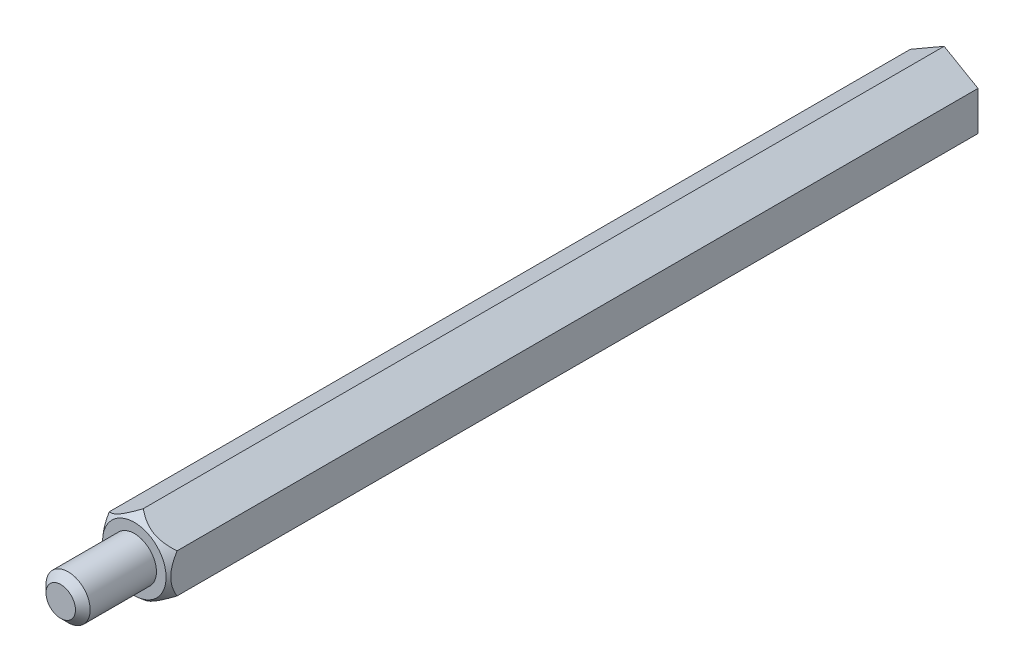
ISO-10303-21;
HEADER;
FILE_DESCRIPTION(('STEP AP214'),'2;1');
FILE_NAME('part.step','',(''),(''),'','','');
FILE_SCHEMA(('AUTOMOTIVE_DESIGN { 1 0 10303 214 1 1 1 1 }'));
ENDSEC;
DATA;
#1=APPLICATION_CONTEXT('core data for automotive mechanical design processes');
#2=APPLICATION_PROTOCOL_DEFINITION('international standard','automotive_design',2000,#1);
#3=PRODUCT_CONTEXT('',#1,'mechanical');
#4=PRODUCT('Part','Part','',(#3));
#5=PRODUCT_RELATED_PRODUCT_CATEGORY('part','',(#4));
#6=PRODUCT_DEFINITION_FORMATION('','',#4);
#7=PRODUCT_DEFINITION_CONTEXT('part definition',#1,'design');
#8=PRODUCT_DEFINITION('design','',#6,#7);
#9=PRODUCT_DEFINITION_SHAPE('','',#8);
#10=(LENGTH_UNIT() NAMED_UNIT(*) SI_UNIT(.MILLI.,.METRE.));
#11=(NAMED_UNIT(*) PLANE_ANGLE_UNIT() SI_UNIT($,.RADIAN.));
#12=(NAMED_UNIT(*) SI_UNIT($,.STERADIAN.) SOLID_ANGLE_UNIT());
#13=UNCERTAINTY_MEASURE_WITH_UNIT(LENGTH_MEASURE(1.E-05),#10,'distance_accuracy_value','');
#14=(GEOMETRIC_REPRESENTATION_CONTEXT(3) GLOBAL_UNCERTAINTY_ASSIGNED_CONTEXT((#13)) GLOBAL_UNIT_ASSIGNED_CONTEXT((#10,
#11,#12)) REPRESENTATION_CONTEXT('',''));
#15=CARTESIAN_POINT('',(0.,0.,0.));
#16=DIRECTION('',(0.,0.,1.));
#17=DIRECTION('',(1.,0.,0.));
#18=AXIS2_PLACEMENT_3D('',#15,#16,#17);
#19=CARTESIAN_POINT('',(-2.3,1.32790561913614,0.));
#20=DIRECTION('',(-1.,0.,0.));
#21=DIRECTION('',(0.,0.,1.));
#22=AXIS2_PLACEMENT_3D('',#19,#20,#21);
#23=PLANE('',#22);
#24=DIRECTION('',(0.,0.,1.));
#25=VECTOR('',#24,1.);
#26=CARTESIAN_POINT('',(-2.3,-1.32790561913614,0.));
#27=LINE('',#26,#25);
#28=CARTESIAN_POINT('',(-2.30000000000001,-1.32790561913612,-25.));
#29=VERTEX_POINT('',#28);
#30=CARTESIAN_POINT('',(-2.3,-1.32790561913614,29.4002265140733));
#31=VERTEX_POINT('',#30);
#32=EDGE_CURVE('E71',#29,#31,#27,.T.);
#33=ORIENTED_EDGE('',*,*,#32,.T.);
#34=CARTESIAN_POINT('',(-2.3,-1.32790561913614,29.4002265140733));
#35=CARTESIAN_POINT('',(-2.3,0.,30.196969885555));
#36=CARTESIAN_POINT('',(-2.3,1.32790561913614,29.4002265140733));
#37=(BOUNDED_CURVE() B_SPLINE_CURVE(2,(#34,#35,#36),.UNSPECIFIED.,.F.,
.F.) B_SPLINE_CURVE_WITH_KNOTS((3,3),(3.43395925265938E-05,0.279023779085286),
.UNSPECIFIED.) CURVE() GEOMETRIC_REPRESENTATION_ITEM() RATIONAL_B_SPLINE_CURVE((1.0000380889664,
1.15474451972925,1.0000380889664)) REPRESENTATION_ITEM(''));
#38=CARTESIAN_POINT('',(-2.3,1.32790561913614,29.4002265140733));
#39=VERTEX_POINT('',#38);
#40=EDGE_CURVE('E137',#31,#39,#37,.T.);
#41=ORIENTED_EDGE('',*,*,#40,.T.);
#42=DIRECTION('',(0.,0.,1.));
#43=VECTOR('',#42,1.);
#44=CARTESIAN_POINT('',(-2.3,1.32790561913614,0.));
#45=LINE('',#44,#43);
#46=CARTESIAN_POINT('',(-2.29999999999999,1.32790561913617,-25.));
#47=VERTEX_POINT('',#46);
#48=EDGE_CURVE('E148',#47,#39,#45,.T.);
#49=ORIENTED_EDGE('',*,*,#48,.F.);
#50=DIRECTION('',(0.,1.,0.));
#51=VECTOR('',#50,1.);
#52=CARTESIAN_POINT('',(-2.30000000000001,-1.32790561913612,-25.));
#53=LINE('',#52,#51);
#54=EDGE_CURVE('E230',#29,#47,#53,.T.);
#55=ORIENTED_EDGE('',*,*,#54,.F.);
#56=EDGE_LOOP('',(#33,#41,#49,#55));
#57=FACE_BOUND('',#56,.T.);
#58=ADVANCED_FACE('F48',(#57),#23,.T.);
#59=CARTESIAN_POINT('',(-2.3,-1.32790561913614,0.));
#60=DIRECTION('',(-0.5,-0.866025403784439,0.));
#61=DIRECTION('',(-0.866025403784439,0.5,0.));
#62=AXIS2_PLACEMENT_3D('',#59,#60,#61);
#63=PLANE('',#62);
#64=DIRECTION('',(0.,0.,1.));
#65=VECTOR('',#64,1.);
#66=CARTESIAN_POINT('',(0.,-2.65581123827228,0.));
#67=LINE('',#66,#65);
#68=CARTESIAN_POINT('',(0.,-2.65581123827228,-25.));
#69=VERTEX_POINT('',#68);
#70=CARTESIAN_POINT('',(0.,-2.65581123827228,29.4002265140733));
#71=VERTEX_POINT('',#70);
#72=EDGE_CURVE('E125',#69,#71,#67,.T.);
#73=ORIENTED_EDGE('',*,*,#72,.T.);
#74=CARTESIAN_POINT('',(0.,-2.65581123827228,29.4002265140733));
#75=CARTESIAN_POINT('',(-1.15,-1.99185842870421,30.196969885555));
#76=CARTESIAN_POINT('',(-2.3,-1.32790561913614,29.4002265140733));
#77=(BOUNDED_CURVE() B_SPLINE_CURVE(2,(#74,#75,#76),.UNSPECIFIED.,.F.,
.F.) B_SPLINE_CURVE_WITH_KNOTS((3,3),(3.43395925253617E-05,0.279023779085284),
.UNSPECIFIED.) CURVE() GEOMETRIC_REPRESENTATION_ITEM() RATIONAL_B_SPLINE_CURVE((1.0000380889664,
1.15474451972924,1.0000380889664)) REPRESENTATION_ITEM(''));
#78=EDGE_CURVE('E141',#71,#31,#77,.T.);
#79=ORIENTED_EDGE('',*,*,#78,.T.);
#80=ORIENTED_EDGE('',*,*,#32,.F.);
#81=DIRECTION('',(-0.866025403784434,0.500000000000007,0.));
#82=VECTOR('',#81,1.);
#83=CARTESIAN_POINT('',(0.,-2.65581123827228,-25.));
#84=LINE('',#83,#82);
#85=EDGE_CURVE('E233',#69,#29,#84,.T.);
#86=ORIENTED_EDGE('',*,*,#85,.F.);
#87=EDGE_LOOP('',(#73,#79,#80,#86));
#88=FACE_BOUND('',#87,.T.);
#89=ADVANCED_FACE('F177',(#88),#63,.T.);
#90=CARTESIAN_POINT('',(0.,2.65581123827228,0.));
#91=DIRECTION('',(-0.5,0.866025403784439,0.));
#92=DIRECTION('',(0.,0.,1.));
#93=AXIS2_PLACEMENT_3D('',#90,#91,#92);
#94=PLANE('',#93);
#95=ORIENTED_EDGE('',*,*,#48,.T.);
#96=CARTESIAN_POINT('',(-2.3,1.32790561913614,29.4002265140733));
#97=CARTESIAN_POINT('',(-1.15,1.99185842870421,30.1969698855549));
#98=CARTESIAN_POINT('',(0.,2.65581123827228,29.4002265140733));
#99=(BOUNDED_CURVE() B_SPLINE_CURVE(2,(#96,#97,#98),.UNSPECIFIED.,.F.,
.F.) B_SPLINE_CURVE_WITH_KNOTS((3,3),(3.43395925253182E-05,0.279023779085284),
.UNSPECIFIED.) CURVE() GEOMETRIC_REPRESENTATION_ITEM() RATIONAL_B_SPLINE_CURVE((1.0000380889664,
1.15474451972924,1.0000380889664)) REPRESENTATION_ITEM(''));
#100=CARTESIAN_POINT('',(0.,2.65581123827228,29.4002265140733));
#101=VERTEX_POINT('',#100);
#102=EDGE_CURVE('E142',#39,#101,#99,.T.);
#103=ORIENTED_EDGE('',*,*,#102,.T.);
#104=DIRECTION('',(0.,0.,1.));
#105=VECTOR('',#104,1.);
#106=CARTESIAN_POINT('',(0.,2.65581123827228,0.));
#107=LINE('',#106,#105);
#108=CARTESIAN_POINT('',(0.,2.65581123827228,-25.));
#109=VERTEX_POINT('',#108);
#110=EDGE_CURVE('E118',#109,#101,#107,.T.);
#111=ORIENTED_EDGE('',*,*,#110,.F.);
#112=DIRECTION('',(0.866025403784442,0.499999999999995,0.));
#113=VECTOR('',#112,1.);
#114=CARTESIAN_POINT('',(-2.29999999999999,1.32790561913617,-25.));
#115=LINE('',#114,#113);
#116=EDGE_CURVE('E271',#47,#109,#115,.T.);
#117=ORIENTED_EDGE('',*,*,#116,.F.);
#118=EDGE_LOOP('',(#95,#103,#111,#117));
#119=FACE_BOUND('',#118,.T.);
#120=ADVANCED_FACE('F182',(#119),#94,.T.);
#121=CARTESIAN_POINT('',(0.,0.,29.7));
#122=DIRECTION('',(0.,0.,-1.));
#123=DIRECTION('',(0.,1.,0.));
#124=AXIS2_PLACEMENT_3D('',#121,#122,#123);
#125=CONICAL_SURFACE('',#124,2.406,0.694738276196703);
#126=CARTESIAN_POINT('',(2.3,-1.32790561913614,29.4002265140733));
#127=CARTESIAN_POINT('',(1.15,-1.99185842870421,30.196969885555));
#128=CARTESIAN_POINT('',(0.,-2.65581123827228,29.4002265140733));
#129=(BOUNDED_CURVE() B_SPLINE_CURVE(2,(#126,#127,#128),.UNSPECIFIED.,.F.,
.F.) B_SPLINE_CURVE_WITH_KNOTS((3,3),(3.43395925266547E-05,0.279023779085286),
.UNSPECIFIED.) CURVE() GEOMETRIC_REPRESENTATION_ITEM() RATIONAL_B_SPLINE_CURVE((1.0000380889664,
1.15474451972925,1.0000380889664)) REPRESENTATION_ITEM(''));
#130=CARTESIAN_POINT('',(2.3,-1.32790561913614,29.4002265140733));
#131=VERTEX_POINT('',#130);
#132=EDGE_CURVE('E101',#131,#71,#129,.T.);
#133=ORIENTED_EDGE('',*,*,#132,.F.);
#134=CARTESIAN_POINT('',(2.3,1.32790561913614,29.4002265140733));
#135=CARTESIAN_POINT('',(2.3,0.,30.196969885555));
#136=CARTESIAN_POINT('',(2.3,-1.32790561913614,29.4002265140733));
#137=(BOUNDED_CURVE() B_SPLINE_CURVE(2,(#134,#135,#136),.UNSPECIFIED.,.F.,
.F.) B_SPLINE_CURVE_WITH_KNOTS((3,3),(3.43395925266313E-05,0.279023779085287),
.UNSPECIFIED.) CURVE() GEOMETRIC_REPRESENTATION_ITEM() RATIONAL_B_SPLINE_CURVE((1.0000380889664,
1.15474451972924,1.0000380889664)) REPRESENTATION_ITEM(''));
#138=CARTESIAN_POINT('',(2.3,1.32790561913614,29.4002265140733));
#139=VERTEX_POINT('',#138);
#140=EDGE_CURVE('E111',#139,#131,#137,.T.);
#141=ORIENTED_EDGE('',*,*,#140,.F.);
#142=CARTESIAN_POINT('',(0.,2.65581123827228,29.4002265140733));
#143=CARTESIAN_POINT('',(1.15,1.99185842870421,30.1969698855549));
#144=CARTESIAN_POINT('',(2.3,1.32790561913614,29.4002265140733));
#145=(BOUNDED_CURVE() B_SPLINE_CURVE(2,(#142,#143,#144),.UNSPECIFIED.,.F.,
.F.) B_SPLINE_CURVE_WITH_KNOTS((3,3),(3.43395925258995E-05,0.279023779085286),
.UNSPECIFIED.) CURVE() GEOMETRIC_REPRESENTATION_ITEM() RATIONAL_B_SPLINE_CURVE((1.0000380889664,
1.15474451972925,1.0000380889664)) REPRESENTATION_ITEM(''));
#146=EDGE_CURVE('E149',#101,#139,#145,.T.);
#147=ORIENTED_EDGE('',*,*,#146,.F.);
#148=ORIENTED_EDGE('',*,*,#102,.F.);
#149=ORIENTED_EDGE('',*,*,#40,.F.);
#150=ORIENTED_EDGE('',*,*,#78,.F.);
#151=DIRECTION('',(0.,0.64018439966448,0.768221279597376));
#152=VECTOR('',#151,1.);
#153=CARTESIAN_POINT('',(0.,-2.406,29.7));
#154=LINE('',#153,#152);
#155=CARTESIAN_POINT('',(0.,-2.156,30.));
#156=VERTEX_POINT('',#155);
#157=EDGE_CURVE('E123',#71,#156,#154,.T.);
#158=ORIENTED_EDGE('',*,*,#157,.T.);
#159=CARTESIAN_POINT('',(0.,0.,30.));
#160=DIRECTION('',(0.,0.,1.));
#161=DIRECTION('',(0.,1.,0.));
#162=AXIS2_PLACEMENT_3D('',#159,#160,#161);
#163=CIRCLE('',#162,2.156);
#164=EDGE_CURVE('E108',#156,#156,#163,.T.);
#165=ORIENTED_EDGE('',*,*,#164,.F.);
#166=ORIENTED_EDGE('',*,*,#157,.F.);
#167=EDGE_LOOP('',(#133,#141,#147,#148,#149,#150,#158,#165,#166));
#168=FACE_BOUND('',#167,.T.);
#169=ADVANCED_FACE('F121',(#168),#125,.T.);
#170=CARTESIAN_POINT('',(2.3,1.32790561913614,0.));
#171=DIRECTION('',(0.5,0.866025403784439,0.));
#172=DIRECTION('',(0.,0.,-1.));
#173=AXIS2_PLACEMENT_3D('',#170,#171,#172);
#174=PLANE('',#173);
#175=ORIENTED_EDGE('',*,*,#110,.T.);
#176=ORIENTED_EDGE('',*,*,#146,.T.);
#177=DIRECTION('',(0.,0.,1.));
#178=VECTOR('',#177,1.);
#179=CARTESIAN_POINT('',(2.3,1.32790561913614,0.));
#180=LINE('',#179,#178);
#181=CARTESIAN_POINT('',(2.3,1.32790561913613,-25.));
#182=VERTEX_POINT('',#181);
#183=EDGE_CURVE('E114',#182,#139,#180,.T.);
#184=ORIENTED_EDGE('',*,*,#183,.F.);
#185=DIRECTION('',(0.866025403784438,-0.500000000000001,0.));
#186=VECTOR('',#185,1.);
#187=CARTESIAN_POINT('',(0.,2.65581123827228,-25.));
#188=LINE('',#187,#186);
#189=EDGE_CURVE('E266',#109,#182,#188,.T.);
#190=ORIENTED_EDGE('',*,*,#189,.F.);
#191=EDGE_LOOP('',(#175,#176,#184,#190));
#192=FACE_BOUND('',#191,.T.);
#193=ADVANCED_FACE('F190',(#192),#174,.T.);
#194=CARTESIAN_POINT('',(2.3,-1.32790561913614,0.));
#195=DIRECTION('',(1.,0.,0.));
#196=DIRECTION('',(0.,-1.,0.));
#197=AXIS2_PLACEMENT_3D('',#194,#195,#196);
#198=PLANE('',#197);
#199=ORIENTED_EDGE('',*,*,#183,.T.);
#200=ORIENTED_EDGE('',*,*,#140,.T.);
#201=DIRECTION('',(0.,0.,1.));
#202=VECTOR('',#201,1.);
#203=CARTESIAN_POINT('',(2.3,-1.32790561913614,0.));
#204=LINE('',#203,#202);
#205=CARTESIAN_POINT('',(2.29999999999999,-1.32790561913615,-25.));
#206=VERTEX_POINT('',#205);
#207=EDGE_CURVE('E96',#206,#131,#204,.T.);
#208=ORIENTED_EDGE('',*,*,#207,.F.);
#209=DIRECTION('',(0.,-1.,0.));
#210=VECTOR('',#209,1.);
#211=CARTESIAN_POINT('',(2.3,1.32790561913613,-25.));
#212=LINE('',#211,#210);
#213=EDGE_CURVE('E270',#182,#206,#212,.T.);
#214=ORIENTED_EDGE('',*,*,#213,.F.);
#215=EDGE_LOOP('',(#199,#200,#208,#214));
#216=FACE_BOUND('',#215,.T.);
#217=ADVANCED_FACE('F112',(#216),#198,.T.);
#218=CARTESIAN_POINT('',(0.,-2.65581123827228,0.));
#219=DIRECTION('',(0.5,-0.866025403784439,0.));
#220=DIRECTION('',(0.,0.,-1.));
#221=AXIS2_PLACEMENT_3D('',#218,#219,#220);
#222=PLANE('',#221);
#223=ORIENTED_EDGE('',*,*,#207,.T.);
#224=ORIENTED_EDGE('',*,*,#132,.T.);
#225=ORIENTED_EDGE('',*,*,#72,.F.);
#226=DIRECTION('',(-0.866025403784442,-0.499999999999995,0.));
#227=VECTOR('',#226,1.);
#228=CARTESIAN_POINT('',(2.29999999999999,-1.32790561913615,-25.));
#229=LINE('',#228,#227);
#230=EDGE_CURVE('E104',#206,#69,#229,.T.);
#231=ORIENTED_EDGE('',*,*,#230,.F.);
#232=EDGE_LOOP('',(#223,#224,#225,#231));
#233=FACE_BOUND('',#232,.T.);
#234=ADVANCED_FACE('F98',(#233),#222,.T.);
#235=CARTESIAN_POINT('',(0.,0.,30.));
#236=DIRECTION('',(0.,0.,1.));
#237=DIRECTION('',(1.,0.,0.));
#238=AXIS2_PLACEMENT_3D('',#235,#236,#237);
#239=PLANE('',#238);
#240=CARTESIAN_POINT('',(0.,0.,30.));
#241=DIRECTION('',(0.,0.,1.));
#242=DIRECTION('',(1.,0.,0.));
#243=AXIS2_PLACEMENT_3D('',#240,#241,#242);
#244=CIRCLE('',#243,1.5);
#245=CARTESIAN_POINT('',(1.5,0.,30.));
#246=VERTEX_POINT('',#245);
#247=EDGE_CURVE('E229',#246,#246,#244,.T.);
#248=ORIENTED_EDGE('',*,*,#247,.F.);
#249=EDGE_LOOP('',(#248));
#250=FACE_BOUND('',#249,.T.);
#251=ORIENTED_EDGE('',*,*,#164,.T.);
#252=EDGE_LOOP('',(#251));
#253=FACE_BOUND('',#252,.T.);
#254=ADVANCED_FACE('F191',(#250,#253),#239,.T.);
#255=CARTESIAN_POINT('',(0.,0.,35.));
#256=DIRECTION('',(0.,0.,-1.));
#257=DIRECTION('',(-1.,0.,0.));
#258=AXIS2_PLACEMENT_3D('',#255,#256,#257);
#259=CYLINDRICAL_SURFACE('',#258,1.5);
#260=CARTESIAN_POINT('',(0.,0.,34.5));
#261=DIRECTION('',(0.,0.,1.));
#262=DIRECTION('',(1.,0.,0.));
#263=AXIS2_PLACEMENT_3D('',#260,#261,#262);
#264=CIRCLE('',#263,1.5);
#265=CARTESIAN_POINT('',(1.5,0.,34.5));
#266=VERTEX_POINT('',#265);
#267=EDGE_CURVE('E161',#266,#266,#264,.F.);
#268=ORIENTED_EDGE('',*,*,#267,.T.);
#269=EDGE_LOOP('',(#268));
#270=FACE_BOUND('',#269,.T.);
#271=ORIENTED_EDGE('',*,*,#247,.T.);
#272=EDGE_LOOP('',(#271));
#273=FACE_BOUND('',#272,.T.);
#274=ADVANCED_FACE('F194',(#270,#273),#259,.T.);
#275=CARTESIAN_POINT('',(0.,0.,35.));
#276=DIRECTION('',(0.,0.,1.));
#277=DIRECTION('',(1.,0.,0.));
#278=AXIS2_PLACEMENT_3D('',#275,#276,#277);
#279=PLANE('',#278);
#280=CARTESIAN_POINT('',(0.,0.,35.));
#281=DIRECTION('',(0.,0.,1.));
#282=DIRECTION('',(1.,0.,0.));
#283=AXIS2_PLACEMENT_3D('',#280,#281,#282);
#284=CIRCLE('',#283,1.00000000000001);
#285=CARTESIAN_POINT('',(1.00000000000001,0.,35.));
#286=VERTEX_POINT('',#285);
#287=EDGE_CURVE('E158',#286,#286,#284,.T.);
#288=ORIENTED_EDGE('',*,*,#287,.T.);
#289=EDGE_LOOP('',(#288));
#290=FACE_BOUND('',#289,.T.);
#291=ADVANCED_FACE('F211',(#290),#279,.T.);
#292=CARTESIAN_POINT('',(0.,0.,35.));
#293=DIRECTION('',(0.,0.,-1.));
#294=DIRECTION('',(-1.,0.,0.));
#295=AXIS2_PLACEMENT_3D('',#292,#293,#294);
#296=CONICAL_SURFACE('',#295,1.00000000000001,0.78539816339744);
#297=ORIENTED_EDGE('',*,*,#267,.F.);
#298=EDGE_LOOP('',(#297));
#299=FACE_BOUND('',#298,.T.);
#300=ORIENTED_EDGE('',*,*,#287,.F.);
#301=EDGE_LOOP('',(#300));
#302=FACE_BOUND('',#301,.T.);
#303=ADVANCED_FACE('F206',(#299,#302),#296,.T.);
#304=CARTESIAN_POINT('',(0.,0.,-25.));
#305=DIRECTION('',(0.,0.,-1.));
#306=DIRECTION('',(-1.,0.,0.));
#307=AXIS2_PLACEMENT_3D('',#304,#305,#306);
#308=PLANE('',#307);
#309=CARTESIAN_POINT('',(0.,0.,-25.));
#310=DIRECTION('',(0.,0.,-1.));
#311=DIRECTION('',(-1.,0.,0.));
#312=AXIS2_PLACEMENT_3D('',#309,#310,#311);
#313=CIRCLE('',#312,1.83555000000002);
#314=CARTESIAN_POINT('',(-1.83555000000002,0.,-25.));
#315=VERTEX_POINT('',#314);
#316=EDGE_CURVE('E11',#315,#315,#313,.F.);
#317=ORIENTED_EDGE('',*,*,#316,.T.);
#318=EDGE_LOOP('',(#317));
#319=FACE_BOUND('',#318,.T.);
#320=ORIENTED_EDGE('',*,*,#116,.T.);
#321=ORIENTED_EDGE('',*,*,#189,.T.);
#322=ORIENTED_EDGE('',*,*,#213,.T.);
#323=ORIENTED_EDGE('',*,*,#230,.T.);
#324=ORIENTED_EDGE('',*,*,#85,.T.);
#325=ORIENTED_EDGE('',*,*,#54,.T.);
#326=EDGE_LOOP('',(#320,#321,#322,#323,#324,#325));
#327=FACE_BOUND('',#326,.T.);
#328=ADVANCED_FACE('F210',(#319,#327),#308,.T.);
#329=CARTESIAN_POINT('',(0.,0.,28.));
#330=DIRECTION('',(0.,0.,1.));
#331=DIRECTION('',(1.,0.,0.));
#332=AXIS2_PLACEMENT_3D('',#329,#330,#331);
#333=PLANE('',#332);
#334=CARTESIAN_POINT('',(0.,0.,28.));
#335=DIRECTION('',(0.,0.,1.));
#336=DIRECTION('',(1.,0.,0.));
#337=AXIS2_PLACEMENT_3D('',#334,#335,#336);
#338=CIRCLE('',#337,1.33555);
#339=CARTESIAN_POINT('',(-1.33555,0.,28.));
#340=VERTEX_POINT('',#339);
#341=EDGE_CURVE('E147',#340,#340,#338,.F.);
#342=ORIENTED_EDGE('',*,*,#341,.T.);
#343=EDGE_LOOP('',(#342));
#344=FACE_BOUND('',#343,.T.);
#345=ADVANCED_FACE('F173',(#344),#333,.F.);
#346=CARTESIAN_POINT('',(0.,0.,0.));
#347=DIRECTION('',(0.,0.,1.));
#348=DIRECTION('',(1.,0.,0.));
#349=AXIS2_PLACEMENT_3D('',#346,#347,#348);
#350=CYLINDRICAL_SURFACE('',#349,1.33555);
#351=CARTESIAN_POINT('',(0.,0.,-24.5));
#352=DIRECTION('',(0.,0.,-1.));
#353=DIRECTION('',(-1.,0.,0.));
#354=AXIS2_PLACEMENT_3D('',#351,#352,#353);
#355=CIRCLE('',#354,1.33555);
#356=CARTESIAN_POINT('',(-1.33555,0.,-24.5));
#357=VERTEX_POINT('',#356);
#358=EDGE_CURVE('E57',#357,#357,#355,.T.);
#359=ORIENTED_EDGE('',*,*,#358,.T.);
#360=EDGE_LOOP('',(#359));
#361=FACE_BOUND('',#360,.T.);
#362=DIRECTION('',(0.,0.,-1.));
#363=VECTOR('',#362,1.);
#364=CARTESIAN_POINT('',(-1.33555,0.,0.));
#365=LINE('',#364,#363);
#366=CARTESIAN_POINT('',(-1.33555,0.,10.));
#367=VERTEX_POINT('',#366);
#368=EDGE_CURVE('E63',#340,#367,#365,.T.);
#369=ORIENTED_EDGE('',*,*,#368,.T.);
#370=ORIENTED_EDGE('',*,*,#368,.F.);
#371=ORIENTED_EDGE('',*,*,#341,.F.);
#372=EDGE_LOOP('',(#369,#370,#371));
#373=FACE_BOUND('',#372,.T.);
#374=ADVANCED_FACE('F166',(#361,#373),#350,.F.);
#375=CARTESIAN_POINT('',(0.,0.,-24.5));
#376=DIRECTION('',(0.,0.,-1.));
#377=DIRECTION('',(-1.,0.,0.));
#378=AXIS2_PLACEMENT_3D('',#375,#376,#377);
#379=CONICAL_SURFACE('',#378,1.33555,0.78539816339745);
#380=ORIENTED_EDGE('',*,*,#316,.F.);
#381=EDGE_LOOP('',(#380));
#382=FACE_BOUND('',#381,.T.);
#383=ORIENTED_EDGE('',*,*,#358,.F.);
#384=EDGE_LOOP('',(#383));
#385=FACE_BOUND('',#384,.T.);
#386=ADVANCED_FACE('F51',(#382,#385),#379,.F.);
#387=CLOSED_SHELL('',(#58,#89,#120,#169,#193,#217,#234,#254,#274,#291,#303,#328,#345,#374,#386));
#388=MANIFOLD_SOLID_BREP('B2',#387);
#389=ADVANCED_BREP_SHAPE_REPRESENTATION('',(#18,#388),#14);
#390=SHAPE_DEFINITION_REPRESENTATION(#9,#389);
ENDSEC;
END-ISO-10303-21;
